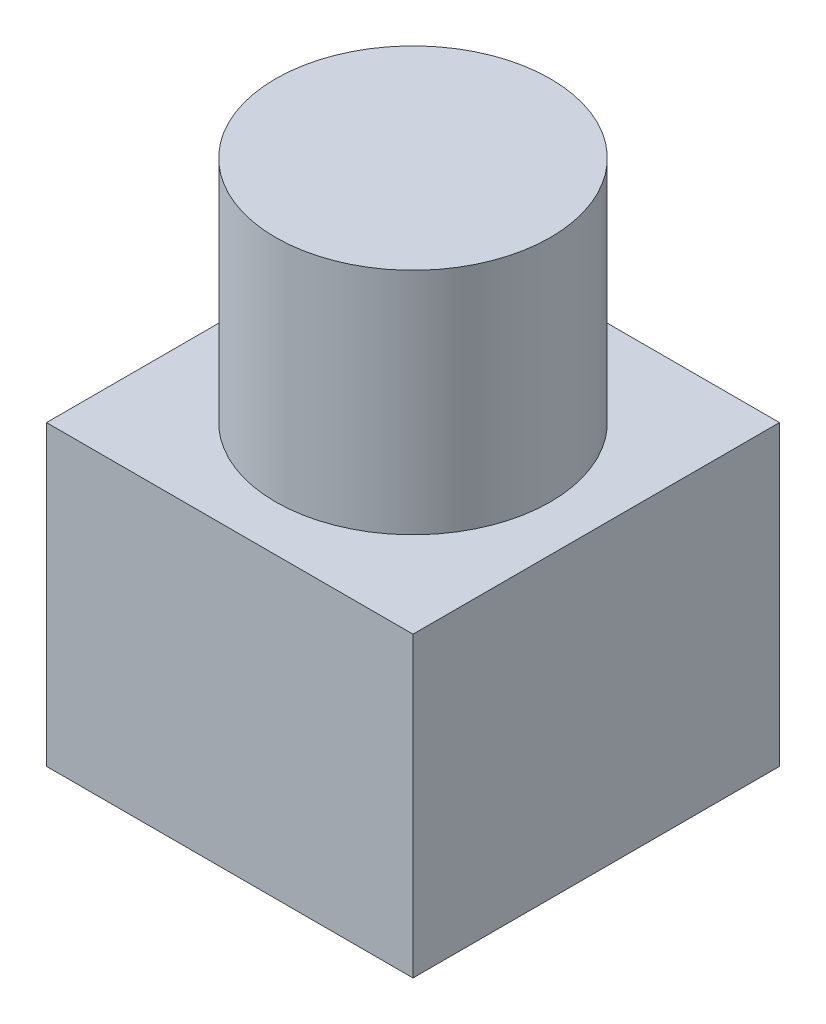
ISO-10303-21;
HEADER;
FILE_DESCRIPTION(('STEP AP214'),'2;1');
FILE_NAME('part.step','',(''),(''),'','','');
FILE_SCHEMA(('AUTOMOTIVE_DESIGN { 1 0 10303 214 1 1 1 1 }'));
ENDSEC;
DATA;
#1=APPLICATION_CONTEXT('core data for automotive mechanical design processes');
#2=APPLICATION_PROTOCOL_DEFINITION('international standard','automotive_design',2000,#1);
#3=PRODUCT_CONTEXT('',#1,'mechanical');
#4=PRODUCT('Part','Part','',(#3));
#5=PRODUCT_RELATED_PRODUCT_CATEGORY('part','',(#4));
#6=PRODUCT_DEFINITION_FORMATION('','',#4);
#7=PRODUCT_DEFINITION_CONTEXT('part definition',#1,'design');
#8=PRODUCT_DEFINITION('design','',#6,#7);
#9=PRODUCT_DEFINITION_SHAPE('','',#8);
#10=(LENGTH_UNIT() NAMED_UNIT(*) SI_UNIT(.MILLI.,.METRE.));
#11=(NAMED_UNIT(*) PLANE_ANGLE_UNIT() SI_UNIT($,.RADIAN.));
#12=(NAMED_UNIT(*) SI_UNIT($,.STERADIAN.) SOLID_ANGLE_UNIT());
#13=UNCERTAINTY_MEASURE_WITH_UNIT(LENGTH_MEASURE(1.E-05),#10,'distance_accuracy_value','');
#14=(GEOMETRIC_REPRESENTATION_CONTEXT(3) GLOBAL_UNCERTAINTY_ASSIGNED_CONTEXT((#13)) GLOBAL_UNIT_ASSIGNED_CONTEXT((#10,
#11,#12)) REPRESENTATION_CONTEXT('',''));
#15=CARTESIAN_POINT('',(0.,0.,0.));
#16=DIRECTION('',(0.,0.,1.));
#17=DIRECTION('',(1.,0.,0.));
#18=AXIS2_PLACEMENT_3D('',#15,#16,#17);
#19=CARTESIAN_POINT('',(4.,6.5,4.));
#20=DIRECTION('',(-1.,0.,0.));
#21=DIRECTION('',(0.,0.,1.));
#22=AXIS2_PLACEMENT_3D('',#19,#20,#21);
#23=PLANE('',#22);
#24=DIRECTION('',(0.,0.,-1.));
#25=VECTOR('',#24,1.);
#26=CARTESIAN_POINT('',(4.,0.,4.));
#27=LINE('',#26,#25);
#28=CARTESIAN_POINT('',(4.,0.,4.));
#29=VERTEX_POINT('',#28);
#30=CARTESIAN_POINT('',(4.,0.,-4.));
#31=VERTEX_POINT('',#30);
#32=EDGE_CURVE('E116',#29,#31,#27,.T.);
#33=ORIENTED_EDGE('',*,*,#32,.T.);
#34=DIRECTION('',(0.,-1.,0.));
#35=VECTOR('',#34,1.);
#36=CARTESIAN_POINT('',(4.,6.5,-4.));
#37=LINE('',#36,#35);
#38=CARTESIAN_POINT('',(4.,6.5,-4.));
#39=VERTEX_POINT('',#38);
#40=EDGE_CURVE('E48',#39,#31,#37,.T.);
#41=ORIENTED_EDGE('',*,*,#40,.F.);
#42=DIRECTION('',(0.,0.,-1.));
#43=VECTOR('',#42,1.);
#44=CARTESIAN_POINT('',(4.,6.5,4.));
#45=LINE('',#44,#43);
#46=CARTESIAN_POINT('',(4.,6.5,4.));
#47=VERTEX_POINT('',#46);
#48=EDGE_CURVE('E99',#47,#39,#45,.T.);
#49=ORIENTED_EDGE('',*,*,#48,.F.);
#50=DIRECTION('',(0.,-1.,0.));
#51=VECTOR('',#50,1.);
#52=CARTESIAN_POINT('',(4.,6.5,4.));
#53=LINE('',#52,#51);
#54=EDGE_CURVE('E112',#47,#29,#53,.T.);
#55=ORIENTED_EDGE('',*,*,#54,.T.);
#56=EDGE_LOOP('',(#33,#41,#49,#55));
#57=FACE_BOUND('',#56,.T.);
#58=ADVANCED_FACE('F45',(#57),#23,.F.);
#59=CARTESIAN_POINT('',(-4.,6.5,-4.));
#60=DIRECTION('',(0.,0.,1.));
#61=DIRECTION('',(1.,0.,0.));
#62=AXIS2_PLACEMENT_3D('',#59,#60,#61);
#63=PLANE('',#62);
#64=DIRECTION('',(-1.,0.,0.));
#65=VECTOR('',#64,1.);
#66=CARTESIAN_POINT('',(-4.,0.,-4.));
#67=LINE('',#66,#65);
#68=CARTESIAN_POINT('',(-4.,0.,-4.));
#69=VERTEX_POINT('',#68);
#70=EDGE_CURVE('E105',#31,#69,#67,.T.);
#71=ORIENTED_EDGE('',*,*,#70,.T.);
#72=DIRECTION('',(0.,-1.,0.));
#73=VECTOR('',#72,1.);
#74=CARTESIAN_POINT('',(-4.,6.5,-4.));
#75=LINE('',#74,#73);
#76=CARTESIAN_POINT('',(-4.,6.5,-4.));
#77=VERTEX_POINT('',#76);
#78=EDGE_CURVE('E103',#77,#69,#75,.T.);
#79=ORIENTED_EDGE('',*,*,#78,.F.);
#80=DIRECTION('',(-1.,0.,0.));
#81=VECTOR('',#80,1.);
#82=CARTESIAN_POINT('',(-4.,6.5,-4.));
#83=LINE('',#82,#81);
#84=EDGE_CURVE('E94',#39,#77,#83,.T.);
#85=ORIENTED_EDGE('',*,*,#84,.F.);
#86=ORIENTED_EDGE('',*,*,#40,.T.);
#87=EDGE_LOOP('',(#71,#79,#85,#86));
#88=FACE_BOUND('',#87,.T.);
#89=ADVANCED_FACE('F104',(#88),#63,.F.);
#90=CARTESIAN_POINT('',(-4.,6.5,4.));
#91=DIRECTION('',(1.,0.,0.));
#92=DIRECTION('',(0.,0.,-1.));
#93=AXIS2_PLACEMENT_3D('',#90,#91,#92);
#94=PLANE('',#93);
#95=DIRECTION('',(0.,0.,1.));
#96=VECTOR('',#95,1.);
#97=CARTESIAN_POINT('',(-4.,0.,4.));
#98=LINE('',#97,#96);
#99=CARTESIAN_POINT('',(-4.,0.,4.));
#100=VERTEX_POINT('',#99);
#101=EDGE_CURVE('E80',#69,#100,#98,.T.);
#102=ORIENTED_EDGE('',*,*,#101,.T.);
#103=DIRECTION('',(0.,-1.,0.));
#104=VECTOR('',#103,1.);
#105=CARTESIAN_POINT('',(-4.,6.5,4.));
#106=LINE('',#105,#104);
#107=CARTESIAN_POINT('',(-4.,6.5,4.));
#108=VERTEX_POINT('',#107);
#109=EDGE_CURVE('E107',#108,#100,#106,.T.);
#110=ORIENTED_EDGE('',*,*,#109,.F.);
#111=DIRECTION('',(0.,0.,1.));
#112=VECTOR('',#111,1.);
#113=CARTESIAN_POINT('',(-4.,6.5,4.));
#114=LINE('',#113,#112);
#115=EDGE_CURVE('E97',#77,#108,#114,.T.);
#116=ORIENTED_EDGE('',*,*,#115,.F.);
#117=ORIENTED_EDGE('',*,*,#78,.T.);
#118=EDGE_LOOP('',(#102,#110,#116,#117));
#119=FACE_BOUND('',#118,.T.);
#120=ADVANCED_FACE('F108',(#119),#94,.F.);
#121=CARTESIAN_POINT('',(-4.,6.5,4.));
#122=DIRECTION('',(0.,0.,-1.));
#123=DIRECTION('',(-1.,0.,0.));
#124=AXIS2_PLACEMENT_3D('',#121,#122,#123);
#125=PLANE('',#124);
#126=DIRECTION('',(1.,0.,0.));
#127=VECTOR('',#126,1.);
#128=CARTESIAN_POINT('',(-4.,0.,4.));
#129=LINE('',#128,#127);
#130=EDGE_CURVE('E86',#100,#29,#129,.T.);
#131=ORIENTED_EDGE('',*,*,#130,.T.);
#132=ORIENTED_EDGE('',*,*,#54,.F.);
#133=DIRECTION('',(1.,0.,0.));
#134=VECTOR('',#133,1.);
#135=CARTESIAN_POINT('',(-4.,6.5,4.));
#136=LINE('',#135,#134);
#137=EDGE_CURVE('E63',#108,#47,#136,.T.);
#138=ORIENTED_EDGE('',*,*,#137,.F.);
#139=ORIENTED_EDGE('',*,*,#109,.T.);
#140=EDGE_LOOP('',(#131,#132,#138,#139));
#141=FACE_BOUND('',#140,.T.);
#142=ADVANCED_FACE('F130',(#141),#125,.F.);
#143=CARTESIAN_POINT('',(0.,6.5,0.));
#144=DIRECTION('',(0.,-1.,0.));
#145=DIRECTION('',(0.,0.,-1.));
#146=AXIS2_PLACEMENT_3D('',#143,#144,#145);
#147=PLANE('',#146);
#148=CARTESIAN_POINT('',(0.,6.5,0.));
#149=DIRECTION('',(0.,1.,0.));
#150=DIRECTION('',(0.,0.,1.));
#151=AXIS2_PLACEMENT_3D('',#148,#149,#150);
#152=CIRCLE('',#151,3.);
#153=CARTESIAN_POINT('',(0.,6.5,3.));
#154=VERTEX_POINT('',#153);
#155=EDGE_CURVE('E11',#154,#154,#152,.T.);
#156=ORIENTED_EDGE('',*,*,#155,.F.);
#157=EDGE_LOOP('',(#156));
#158=FACE_BOUND('',#157,.T.);
#159=ORIENTED_EDGE('',*,*,#48,.T.);
#160=ORIENTED_EDGE('',*,*,#84,.T.);
#161=ORIENTED_EDGE('',*,*,#115,.T.);
#162=ORIENTED_EDGE('',*,*,#137,.T.);
#163=EDGE_LOOP('',(#159,#160,#161,#162));
#164=FACE_BOUND('',#163,.T.);
#165=ADVANCED_FACE('F95',(#158,#164),#147,.F.);
#166=CARTESIAN_POINT('',(0.,0.,0.));
#167=DIRECTION('',(0.,-1.,0.));
#168=DIRECTION('',(0.,0.,-1.));
#169=AXIS2_PLACEMENT_3D('',#166,#167,#168);
#170=PLANE('',#169);
#171=ORIENTED_EDGE('',*,*,#32,.F.);
#172=ORIENTED_EDGE('',*,*,#130,.F.);
#173=ORIENTED_EDGE('',*,*,#101,.F.);
#174=ORIENTED_EDGE('',*,*,#70,.F.);
#175=EDGE_LOOP('',(#171,#172,#173,#174));
#176=FACE_BOUND('',#175,.T.);
#177=ADVANCED_FACE('F133',(#176),#170,.T.);
#178=CARTESIAN_POINT('',(0.,11.5,0.));
#179=DIRECTION('',(0.,-1.,0.));
#180=DIRECTION('',(0.,0.,-1.));
#181=AXIS2_PLACEMENT_3D('',#178,#179,#180);
#182=CYLINDRICAL_SURFACE('',#181,3.);
#183=CARTESIAN_POINT('',(0.,11.5,0.));
#184=DIRECTION('',(0.,1.,0.));
#185=DIRECTION('',(0.,0.,1.));
#186=AXIS2_PLACEMENT_3D('',#183,#184,#185);
#187=CIRCLE('',#186,3.);
#188=CARTESIAN_POINT('',(0.,11.5,3.));
#189=VERTEX_POINT('',#188);
#190=EDGE_CURVE('E120',#189,#189,#187,.T.);
#191=ORIENTED_EDGE('',*,*,#190,.F.);
#192=EDGE_LOOP('',(#191));
#193=FACE_BOUND('',#192,.T.);
#194=ORIENTED_EDGE('',*,*,#155,.T.);
#195=EDGE_LOOP('',(#194));
#196=FACE_BOUND('',#195,.T.);
#197=ADVANCED_FACE('F143',(#193,#196),#182,.T.);
#198=CARTESIAN_POINT('',(0.,11.5,0.));
#199=DIRECTION('',(0.,1.,0.));
#200=DIRECTION('',(0.,0.,1.));
#201=AXIS2_PLACEMENT_3D('',#198,#199,#200);
#202=PLANE('',#201);
#203=ORIENTED_EDGE('',*,*,#190,.T.);
#204=EDGE_LOOP('',(#203));
#205=FACE_BOUND('',#204,.T.);
#206=ADVANCED_FACE('F141',(#205),#202,.T.);
#207=CLOSED_SHELL('',(#58,#89,#120,#142,#165,#177,#197,#206));
#208=MANIFOLD_SOLID_BREP('B2',#207);
#209=ADVANCED_BREP_SHAPE_REPRESENTATION('',(#18,#208),#14);
#210=SHAPE_DEFINITION_REPRESENTATION(#9,#209);
ENDSEC;
END-ISO-10303-21;
